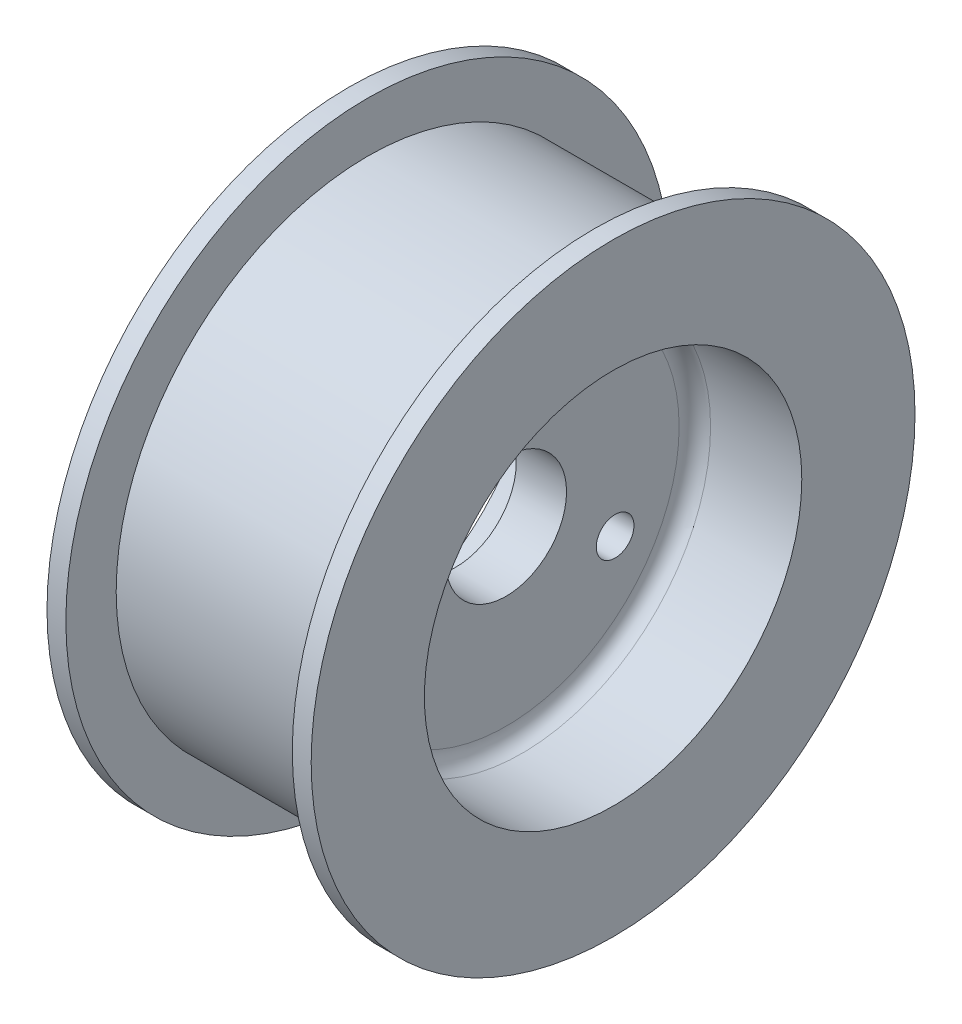
ISO-10303-21;
HEADER;
FILE_DESCRIPTION(('STEP AP214'),'2;1');
FILE_NAME('part.step','',(''),(''),'','','');
FILE_SCHEMA(('AUTOMOTIVE_DESIGN { 1 0 10303 214 1 1 1 1 }'));
ENDSEC;
DATA;
#1=APPLICATION_CONTEXT('core data for automotive mechanical design processes');
#2=APPLICATION_PROTOCOL_DEFINITION('international standard','automotive_design',2000,#1);
#3=PRODUCT_CONTEXT('',#1,'mechanical');
#4=PRODUCT('Part','Part','',(#3));
#5=PRODUCT_RELATED_PRODUCT_CATEGORY('part','',(#4));
#6=PRODUCT_DEFINITION_FORMATION('','',#4);
#7=PRODUCT_DEFINITION_CONTEXT('part definition',#1,'design');
#8=PRODUCT_DEFINITION('design','',#6,#7);
#9=PRODUCT_DEFINITION_SHAPE('','',#8);
#10=(LENGTH_UNIT() NAMED_UNIT(*) SI_UNIT(.MILLI.,.METRE.));
#11=(NAMED_UNIT(*) PLANE_ANGLE_UNIT() SI_UNIT($,.RADIAN.));
#12=(NAMED_UNIT(*) SI_UNIT($,.STERADIAN.) SOLID_ANGLE_UNIT());
#13=UNCERTAINTY_MEASURE_WITH_UNIT(LENGTH_MEASURE(1.E-05),#10,'distance_accuracy_value','');
#14=(GEOMETRIC_REPRESENTATION_CONTEXT(3) GLOBAL_UNCERTAINTY_ASSIGNED_CONTEXT((#13)) GLOBAL_UNIT_ASSIGNED_CONTEXT((#10,
#11,#12)) REPRESENTATION_CONTEXT('',''));
#15=CARTESIAN_POINT('',(0.,0.,0.));
#16=DIRECTION('',(0.,0.,1.));
#17=DIRECTION('',(1.,0.,0.));
#18=AXIS2_PLACEMENT_3D('',#15,#16,#17);
#19=CARTESIAN_POINT('',(2.,0.,0.));
#20=DIRECTION('',(1.,0.,0.));
#21=DIRECTION('',(0.,0.,-1.));
#22=AXIS2_PLACEMENT_3D('',#19,#20,#21);
#23=CYLINDRICAL_SURFACE('',#22,20.);
#24=CARTESIAN_POINT('',(9.,0.,0.));
#25=DIRECTION('',(1.,0.,0.));
#26=DIRECTION('',(0.,0.,-1.));
#27=AXIS2_PLACEMENT_3D('',#24,#25,#26);
#28=CIRCLE('',#27,20.);
#29=CARTESIAN_POINT('',(9.,0.,-20.));
#30=VERTEX_POINT('',#29);
#31=EDGE_CURVE('E64',#30,#30,#28,.T.);
#32=ORIENTED_EDGE('',*,*,#31,.F.);
#33=EDGE_LOOP('',(#32));
#34=FACE_BOUND('',#33,.T.);
#35=CARTESIAN_POINT('',(-9.,0.,0.));
#36=DIRECTION('',(-1.,0.,0.));
#37=DIRECTION('',(0.,0.,1.));
#38=AXIS2_PLACEMENT_3D('',#35,#36,#37);
#39=CIRCLE('',#38,20.);
#40=CARTESIAN_POINT('',(-9.,0.,20.));
#41=VERTEX_POINT('',#40);
#42=EDGE_CURVE('E61',#41,#41,#39,.T.);
#43=ORIENTED_EDGE('',*,*,#42,.F.);
#44=EDGE_LOOP('',(#43));
#45=FACE_BOUND('',#44,.T.);
#46=ADVANCED_FACE('F41',(#34,#45),#23,.T.);
#47=CARTESIAN_POINT('',(2.,0.,0.));
#48=DIRECTION('',(1.,0.,0.));
#49=DIRECTION('',(0.,0.,-1.));
#50=AXIS2_PLACEMENT_3D('',#47,#48,#49);
#51=PLANE('',#50);
#52=CARTESIAN_POINT('',(2.,0.,0.));
#53=DIRECTION('',(1.,0.,0.));
#54=DIRECTION('',(0.,0.,-1.));
#55=AXIS2_PLACEMENT_3D('',#52,#53,#54);
#56=CIRCLE('',#55,13.75);
#57=CARTESIAN_POINT('',(2.,0.,-13.75));
#58=VERTEX_POINT('',#57);
#59=EDGE_CURVE('E48',#58,#58,#56,.T.);
#60=ORIENTED_EDGE('',*,*,#59,.T.);
#61=EDGE_LOOP('',(#60));
#62=FACE_BOUND('',#61,.T.);
#63=CARTESIAN_POINT('',(2.,-5.,-8.66025403784439));
#64=DIRECTION('',(1.,0.,0.));
#65=DIRECTION('',(0.,0.,-1.));
#66=AXIS2_PLACEMENT_3D('',#63,#64,#65);
#67=CIRCLE('',#66,1.5);
#68=CARTESIAN_POINT('',(2.,-5.,-10.1602540378444));
#69=VERTEX_POINT('',#68);
#70=EDGE_CURVE('E77',#69,#69,#67,.T.);
#71=ORIENTED_EDGE('',*,*,#70,.F.);
#72=EDGE_LOOP('',(#71));
#73=FACE_BOUND('',#72,.T.);
#74=CARTESIAN_POINT('',(2.,0.,0.));
#75=DIRECTION('',(1.,0.,0.));
#76=DIRECTION('',(0.,0.,-1.));
#77=AXIS2_PLACEMENT_3D('',#74,#75,#76);
#78=CIRCLE('',#77,4.8);
#79=CARTESIAN_POINT('',(2.,0.,-4.8));
#80=VERTEX_POINT('',#79);
#81=EDGE_CURVE('E67',#80,#80,#78,.T.);
#82=ORIENTED_EDGE('',*,*,#81,.F.);
#83=EDGE_LOOP('',(#82));
#84=FACE_BOUND('',#83,.T.);
#85=CARTESIAN_POINT('',(2.,10.,0.));
#86=DIRECTION('',(1.,0.,0.));
#87=DIRECTION('',(0.,0.,-1.));
#88=AXIS2_PLACEMENT_3D('',#85,#86,#87);
#89=CIRCLE('',#88,1.5);
#90=CARTESIAN_POINT('',(2.,10.,-1.5));
#91=VERTEX_POINT('',#90);
#92=EDGE_CURVE('E71',#91,#91,#89,.T.);
#93=ORIENTED_EDGE('',*,*,#92,.F.);
#94=EDGE_LOOP('',(#93));
#95=FACE_BOUND('',#94,.T.);
#96=CARTESIAN_POINT('',(2.,-5.,8.66025403784439));
#97=DIRECTION('',(1.,0.,0.));
#98=DIRECTION('',(0.,0.,-1.));
#99=AXIS2_PLACEMENT_3D('',#96,#97,#98);
#100=CIRCLE('',#99,1.5);
#101=CARTESIAN_POINT('',(2.,-5.,7.16025403784439));
#102=VERTEX_POINT('',#101);
#103=EDGE_CURVE('E83',#102,#102,#100,.T.);
#104=ORIENTED_EDGE('',*,*,#103,.F.);
#105=EDGE_LOOP('',(#104));
#106=FACE_BOUND('',#105,.T.);
#107=ADVANCED_FACE('F129',(#62,#73,#84,#95,#106),#51,.T.);
#108=CARTESIAN_POINT('',(-2.,0.,0.));
#109=DIRECTION('',(1.,0.,0.));
#110=DIRECTION('',(0.,0.,-1.));
#111=AXIS2_PLACEMENT_3D('',#108,#109,#110);
#112=PLANE('',#111);
#113=CARTESIAN_POINT('',(-2.,0.,0.));
#114=DIRECTION('',(1.,0.,0.));
#115=DIRECTION('',(0.,0.,-1.));
#116=AXIS2_PLACEMENT_3D('',#113,#114,#115);
#117=CIRCLE('',#116,13.75);
#118=CARTESIAN_POINT('',(-2.,0.,-13.75));
#119=VERTEX_POINT('',#118);
#120=EDGE_CURVE('E52',#119,#119,#117,.F.);
#121=ORIENTED_EDGE('',*,*,#120,.T.);
#122=EDGE_LOOP('',(#121));
#123=FACE_BOUND('',#122,.T.);
#124=CARTESIAN_POINT('',(-2.,0.,0.));
#125=DIRECTION('',(1.,0.,0.));
#126=DIRECTION('',(0.,0.,-1.));
#127=AXIS2_PLACEMENT_3D('',#124,#125,#126);
#128=CIRCLE('',#127,4.8);
#129=CARTESIAN_POINT('',(-2.,0.,-4.8));
#130=VERTEX_POINT('',#129);
#131=EDGE_CURVE('E68',#130,#130,#128,.T.);
#132=ORIENTED_EDGE('',*,*,#131,.T.);
#133=EDGE_LOOP('',(#132));
#134=FACE_BOUND('',#133,.T.);
#135=CARTESIAN_POINT('',(-2.,10.,0.));
#136=DIRECTION('',(1.,0.,0.));
#137=DIRECTION('',(0.,0.,-1.));
#138=AXIS2_PLACEMENT_3D('',#135,#136,#137);
#139=CIRCLE('',#138,1.5);
#140=CARTESIAN_POINT('',(-2.,10.,-1.5));
#141=VERTEX_POINT('',#140);
#142=EDGE_CURVE('E74',#141,#141,#139,.T.);
#143=ORIENTED_EDGE('',*,*,#142,.T.);
#144=EDGE_LOOP('',(#143));
#145=FACE_BOUND('',#144,.T.);
#146=CARTESIAN_POINT('',(-2.,-5.,-8.66025403784439));
#147=DIRECTION('',(1.,0.,0.));
#148=DIRECTION('',(0.,0.,-1.));
#149=AXIS2_PLACEMENT_3D('',#146,#147,#148);
#150=CIRCLE('',#149,1.5);
#151=CARTESIAN_POINT('',(-2.,-5.,-10.1602540378444));
#152=VERTEX_POINT('',#151);
#153=EDGE_CURVE('E80',#152,#152,#150,.T.);
#154=ORIENTED_EDGE('',*,*,#153,.T.);
#155=EDGE_LOOP('',(#154));
#156=FACE_BOUND('',#155,.T.);
#157=CARTESIAN_POINT('',(-2.,-5.,8.66025403784439));
#158=DIRECTION('',(1.,0.,0.));
#159=DIRECTION('',(0.,0.,-1.));
#160=AXIS2_PLACEMENT_3D('',#157,#158,#159);
#161=CIRCLE('',#160,1.5);
#162=CARTESIAN_POINT('',(-2.,-5.,7.16025403784439));
#163=VERTEX_POINT('',#162);
#164=EDGE_CURVE('E86',#163,#163,#161,.T.);
#165=ORIENTED_EDGE('',*,*,#164,.T.);
#166=EDGE_LOOP('',(#165));
#167=FACE_BOUND('',#166,.T.);
#168=ADVANCED_FACE('F135',(#123,#134,#145,#156,#167),#112,.F.);
#169=CARTESIAN_POINT('',(2.,0.,0.));
#170=DIRECTION('',(-1.,0.,0.));
#171=DIRECTION('',(0.,0.,1.));
#172=AXIS2_PLACEMENT_3D('',#169,#170,#171);
#173=CYLINDRICAL_SURFACE('',#172,4.8);
#174=ORIENTED_EDGE('',*,*,#81,.T.);
#175=EDGE_LOOP('',(#174));
#176=FACE_BOUND('',#175,.T.);
#177=ORIENTED_EDGE('',*,*,#131,.F.);
#178=EDGE_LOOP('',(#177));
#179=FACE_BOUND('',#178,.T.);
#180=ADVANCED_FACE('F159',(#176,#179),#173,.F.);
#181=CARTESIAN_POINT('',(2.,10.,0.));
#182=DIRECTION('',(-1.,0.,0.));
#183=DIRECTION('',(0.,0.,1.));
#184=AXIS2_PLACEMENT_3D('',#181,#182,#183);
#185=CYLINDRICAL_SURFACE('',#184,1.5);
#186=ORIENTED_EDGE('',*,*,#92,.T.);
#187=EDGE_LOOP('',(#186));
#188=FACE_BOUND('',#187,.T.);
#189=ORIENTED_EDGE('',*,*,#142,.F.);
#190=EDGE_LOOP('',(#189));
#191=FACE_BOUND('',#190,.T.);
#192=ADVANCED_FACE('F155',(#188,#191),#185,.F.);
#193=CARTESIAN_POINT('',(2.,-5.,-8.66025403784439));
#194=DIRECTION('',(-1.,0.,0.));
#195=DIRECTION('',(0.,0.,1.));
#196=AXIS2_PLACEMENT_3D('',#193,#194,#195);
#197=CYLINDRICAL_SURFACE('',#196,1.5);
#198=ORIENTED_EDGE('',*,*,#70,.T.);
#199=EDGE_LOOP('',(#198));
#200=FACE_BOUND('',#199,.T.);
#201=ORIENTED_EDGE('',*,*,#153,.F.);
#202=EDGE_LOOP('',(#201));
#203=FACE_BOUND('',#202,.T.);
#204=ADVANCED_FACE('F151',(#200,#203),#197,.F.);
#205=CARTESIAN_POINT('',(2.,-5.,8.66025403784439));
#206=DIRECTION('',(-1.,0.,0.));
#207=DIRECTION('',(0.,0.,1.));
#208=AXIS2_PLACEMENT_3D('',#205,#206,#207);
#209=CYLINDRICAL_SURFACE('',#208,1.5);
#210=ORIENTED_EDGE('',*,*,#103,.T.);
#211=EDGE_LOOP('',(#210));
#212=FACE_BOUND('',#211,.T.);
#213=ORIENTED_EDGE('',*,*,#164,.F.);
#214=EDGE_LOOP('',(#213));
#215=FACE_BOUND('',#214,.T.);
#216=ADVANCED_FACE('F148',(#212,#215),#209,.F.);
#217=CARTESIAN_POINT('',(2.,0.,0.));
#218=DIRECTION('',(1.,0.,0.));
#219=DIRECTION('',(0.,0.,-1.));
#220=AXIS2_PLACEMENT_3D('',#217,#218,#219);
#221=CYLINDRICAL_SURFACE('',#220,15.);
#222=CARTESIAN_POINT('',(-3.25,0.,0.));
#223=DIRECTION('',(1.,0.,0.));
#224=DIRECTION('',(0.,0.,-1.));
#225=AXIS2_PLACEMENT_3D('',#222,#223,#224);
#226=CIRCLE('',#225,15.);
#227=CARTESIAN_POINT('',(-3.25,0.,-15.));
#228=VERTEX_POINT('',#227);
#229=EDGE_CURVE('E56',#228,#228,#226,.T.);
#230=ORIENTED_EDGE('',*,*,#229,.T.);
#231=EDGE_LOOP('',(#230));
#232=FACE_BOUND('',#231,.T.);
#233=CARTESIAN_POINT('',(-10.5,0.,0.));
#234=DIRECTION('',(1.,0.,0.));
#235=DIRECTION('',(0.,0.,-1.));
#236=AXIS2_PLACEMENT_3D('',#233,#234,#235);
#237=CIRCLE('',#236,15.);
#238=CARTESIAN_POINT('',(-10.5,0.,-15.));
#239=VERTEX_POINT('',#238);
#240=EDGE_CURVE('E94',#239,#239,#237,.T.);
#241=ORIENTED_EDGE('',*,*,#240,.F.);
#242=EDGE_LOOP('',(#241));
#243=FACE_BOUND('',#242,.T.);
#244=ADVANCED_FACE('F146',(#232,#243),#221,.F.);
#245=CARTESIAN_POINT('',(10.5,0.,15.));
#246=DIRECTION('',(-1.,0.,0.));
#247=DIRECTION('',(0.,0.,1.));
#248=AXIS2_PLACEMENT_3D('',#245,#246,#247);
#249=PLANE('',#248);
#250=CARTESIAN_POINT('',(10.5,0.,0.));
#251=DIRECTION('',(1.,0.,0.));
#252=DIRECTION('',(0.,0.,-1.));
#253=AXIS2_PLACEMENT_3D('',#250,#251,#252);
#254=CIRCLE('',#253,15.);
#255=CARTESIAN_POINT('',(10.5,0.,-15.));
#256=VERTEX_POINT('',#255);
#257=EDGE_CURVE('E89',#256,#256,#254,.T.);
#258=ORIENTED_EDGE('',*,*,#257,.F.);
#259=EDGE_LOOP('',(#258));
#260=FACE_BOUND('',#259,.T.);
#261=CARTESIAN_POINT('',(10.5,0.,0.));
#262=DIRECTION('',(1.,0.,0.));
#263=DIRECTION('',(0.,0.,-1.));
#264=AXIS2_PLACEMENT_3D('',#261,#262,#263);
#265=CIRCLE('',#264,24.);
#266=CARTESIAN_POINT('',(10.5,0.,-24.));
#267=VERTEX_POINT('',#266);
#268=EDGE_CURVE('E97',#267,#267,#265,.T.);
#269=ORIENTED_EDGE('',*,*,#268,.T.);
#270=EDGE_LOOP('',(#269));
#271=FACE_BOUND('',#270,.T.);
#272=ADVANCED_FACE('F143',(#260,#271),#249,.F.);
#273=CARTESIAN_POINT('',(-10.5,0.,20.));
#274=DIRECTION('',(1.,0.,0.));
#275=DIRECTION('',(0.,0.,-1.));
#276=AXIS2_PLACEMENT_3D('',#273,#274,#275);
#277=PLANE('',#276);
#278=ORIENTED_EDGE('',*,*,#240,.T.);
#279=EDGE_LOOP('',(#278));
#280=FACE_BOUND('',#279,.T.);
#281=CARTESIAN_POINT('',(-10.5,0.,0.));
#282=DIRECTION('',(1.,0.,0.));
#283=DIRECTION('',(0.,0.,-1.));
#284=AXIS2_PLACEMENT_3D('',#281,#282,#283);
#285=CIRCLE('',#284,24.);
#286=CARTESIAN_POINT('',(-10.5,0.,-24.));
#287=VERTEX_POINT('',#286);
#288=EDGE_CURVE('E103',#287,#287,#285,.T.);
#289=ORIENTED_EDGE('',*,*,#288,.F.);
#290=EDGE_LOOP('',(#289));
#291=FACE_BOUND('',#290,.T.);
#292=ADVANCED_FACE('F141',(#280,#291),#277,.F.);
#293=CARTESIAN_POINT('',(3.25,0.,0.));
#294=DIRECTION('',(1.,0.,0.));
#295=DIRECTION('',(0.,0.,-1.));
#296=AXIS2_PLACEMENT_3D('',#293,#294,#295);
#297=CIRCLE('',#296,15.);
#298=CARTESIAN_POINT('',(3.25,0.,-15.));
#299=VERTEX_POINT('',#298);
#300=EDGE_CURVE('E10',#299,#299,#297,.F.);
#301=ORIENTED_EDGE('',*,*,#300,.T.);
#302=EDGE_LOOP('',(#301));
#303=FACE_BOUND('',#302,.T.);
#304=ORIENTED_EDGE('',*,*,#257,.T.);
#305=EDGE_LOOP('',(#304));
#306=FACE_BOUND('',#305,.T.);
#307=ADVANCED_FACE('F179',(#303,#306),#221,.F.);
#308=CARTESIAN_POINT('',(2.,0.,0.));
#309=DIRECTION('',(1.,0.,0.));
#310=DIRECTION('',(0.,0.,-1.));
#311=AXIS2_PLACEMENT_3D('',#308,#309,#310);
#312=CYLINDRICAL_SURFACE('',#311,24.);
#313=ORIENTED_EDGE('',*,*,#268,.F.);
#314=EDGE_LOOP('',(#313));
#315=FACE_BOUND('',#314,.T.);
#316=CARTESIAN_POINT('',(9.,0.,0.));
#317=DIRECTION('',(1.,0.,0.));
#318=DIRECTION('',(0.,0.,-1.));
#319=AXIS2_PLACEMENT_3D('',#316,#317,#318);
#320=CIRCLE('',#319,24.);
#321=CARTESIAN_POINT('',(9.,0.,-24.));
#322=VERTEX_POINT('',#321);
#323=EDGE_CURVE('E100',#322,#322,#320,.T.);
#324=ORIENTED_EDGE('',*,*,#323,.T.);
#325=EDGE_LOOP('',(#324));
#326=FACE_BOUND('',#325,.T.);
#327=ADVANCED_FACE('F125',(#315,#326),#312,.T.);
#328=CARTESIAN_POINT('',(9.,0.,24.));
#329=DIRECTION('',(1.,0.,0.));
#330=DIRECTION('',(0.,0.,-1.));
#331=AXIS2_PLACEMENT_3D('',#328,#329,#330);
#332=PLANE('',#331);
#333=ORIENTED_EDGE('',*,*,#323,.F.);
#334=EDGE_LOOP('',(#333));
#335=FACE_BOUND('',#334,.T.);
#336=ORIENTED_EDGE('',*,*,#31,.T.);
#337=EDGE_LOOP('',(#336));
#338=FACE_BOUND('',#337,.T.);
#339=ADVANCED_FACE('F115',(#335,#338),#332,.F.);
#340=CARTESIAN_POINT('',(-2.,0.,0.));
#341=DIRECTION('',(-1.,0.,0.));
#342=DIRECTION('',(0.,0.,-1.));
#343=AXIS2_PLACEMENT_3D('',#340,#341,#342);
#344=CYLINDRICAL_SURFACE('',#343,24.);
#345=ORIENTED_EDGE('',*,*,#288,.T.);
#346=EDGE_LOOP('',(#345));
#347=FACE_BOUND('',#346,.T.);
#348=CARTESIAN_POINT('',(-9.,0.,0.));
#349=DIRECTION('',(1.,0.,0.));
#350=DIRECTION('',(0.,0.,-1.));
#351=AXIS2_PLACEMENT_3D('',#348,#349,#350);
#352=CIRCLE('',#351,24.);
#353=CARTESIAN_POINT('',(-9.,0.,-24.));
#354=VERTEX_POINT('',#353);
#355=EDGE_CURVE('E106',#354,#354,#352,.T.);
#356=ORIENTED_EDGE('',*,*,#355,.F.);
#357=EDGE_LOOP('',(#356));
#358=FACE_BOUND('',#357,.T.);
#359=ADVANCED_FACE('F113',(#347,#358),#344,.T.);
#360=CARTESIAN_POINT('',(-9.,0.,24.));
#361=DIRECTION('',(-1.,0.,0.));
#362=DIRECTION('',(0.,0.,-1.));
#363=AXIS2_PLACEMENT_3D('',#360,#361,#362);
#364=PLANE('',#363);
#365=ORIENTED_EDGE('',*,*,#355,.T.);
#366=EDGE_LOOP('',(#365));
#367=FACE_BOUND('',#366,.T.);
#368=ORIENTED_EDGE('',*,*,#42,.T.);
#369=EDGE_LOOP('',(#368));
#370=FACE_BOUND('',#369,.T.);
#371=ADVANCED_FACE('F110',(#367,#370),#364,.F.);
#372=CARTESIAN_POINT('',(-3.25,0.,0.));
#373=DIRECTION('',(1.,0.,0.));
#374=DIRECTION('',(0.,0.,-1.));
#375=AXIS2_PLACEMENT_3D('',#372,#373,#374);
#376=TOROIDAL_SURFACE('',#375,13.75,1.25);
#377=ORIENTED_EDGE('',*,*,#120,.F.);
#378=EDGE_LOOP('',(#377));
#379=FACE_BOUND('',#378,.T.);
#380=ORIENTED_EDGE('',*,*,#229,.F.);
#381=EDGE_LOOP('',(#380));
#382=FACE_BOUND('',#381,.T.);
#383=ADVANCED_FACE('F122',(#379,#382),#376,.F.);
#384=CARTESIAN_POINT('',(3.25,0.,0.));
#385=DIRECTION('',(1.,0.,0.));
#386=DIRECTION('',(0.,0.,-1.));
#387=AXIS2_PLACEMENT_3D('',#384,#385,#386);
#388=TOROIDAL_SURFACE('',#387,13.75,1.25);
#389=ORIENTED_EDGE('',*,*,#300,.F.);
#390=EDGE_LOOP('',(#389));
#391=FACE_BOUND('',#390,.T.);
#392=ORIENTED_EDGE('',*,*,#59,.F.);
#393=EDGE_LOOP('',(#392));
#394=FACE_BOUND('',#393,.T.);
#395=ADVANCED_FACE('F43',(#391,#394),#388,.F.);
#396=CLOSED_SHELL('',(#46,#107,#168,#180,#192,#204,#216,#244,#272,#292,#307,#327,#339,#359,#371,
#383,#395));
#397=MANIFOLD_SOLID_BREP('B2',#396);
#398=ADVANCED_BREP_SHAPE_REPRESENTATION('',(#18,#397),#14);
#399=SHAPE_DEFINITION_REPRESENTATION(#9,#398);
ENDSEC;
END-ISO-10303-21;
